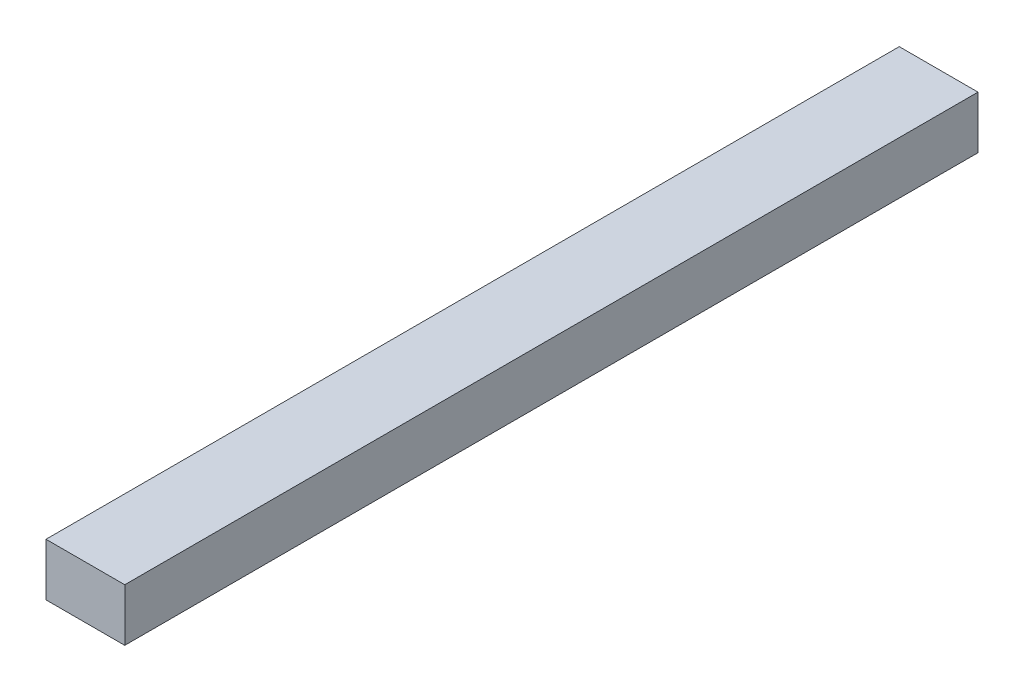
ISO-10303-21;
HEADER;
FILE_DESCRIPTION(('STEP AP214'),'2;1');
FILE_NAME('part.step','',(''),(''),'','','');
FILE_SCHEMA(('AUTOMOTIVE_DESIGN { 1 0 10303 214 1 1 1 1 }'));
ENDSEC;
DATA;
#1=APPLICATION_CONTEXT('core data for automotive mechanical design processes');
#2=APPLICATION_PROTOCOL_DEFINITION('international standard','automotive_design',2000,#1);
#3=PRODUCT_CONTEXT('',#1,'mechanical');
#4=PRODUCT('Part','Part','',(#3));
#5=PRODUCT_RELATED_PRODUCT_CATEGORY('part','',(#4));
#6=PRODUCT_DEFINITION_FORMATION('','',#4);
#7=PRODUCT_DEFINITION_CONTEXT('part definition',#1,'design');
#8=PRODUCT_DEFINITION('design','',#6,#7);
#9=PRODUCT_DEFINITION_SHAPE('','',#8);
#10=(LENGTH_UNIT() NAMED_UNIT(*) SI_UNIT(.MILLI.,.METRE.));
#11=(NAMED_UNIT(*) PLANE_ANGLE_UNIT() SI_UNIT($,.RADIAN.));
#12=(NAMED_UNIT(*) SI_UNIT($,.STERADIAN.) SOLID_ANGLE_UNIT());
#13=UNCERTAINTY_MEASURE_WITH_UNIT(LENGTH_MEASURE(1.E-05),#10,'distance_accuracy_value','');
#14=(GEOMETRIC_REPRESENTATION_CONTEXT(3) GLOBAL_UNCERTAINTY_ASSIGNED_CONTEXT((#13)) GLOBAL_UNIT_ASSIGNED_CONTEXT((#10,
#11,#12)) REPRESENTATION_CONTEXT('',''));
#15=CARTESIAN_POINT('',(0.,0.,0.));
#16=DIRECTION('',(0.,0.,1.));
#17=DIRECTION('',(1.,0.,0.));
#18=AXIS2_PLACEMENT_3D('',#15,#16,#17);
#19=CARTESIAN_POINT('',(-22.8801918066931,33.4498456304373,1300.));
#20=DIRECTION('',(1.,0.,0.));
#21=DIRECTION('',(0.,0.,-1.));
#22=AXIS2_PLACEMENT_3D('',#19,#20,#21);
#23=PLANE('',#22);
#24=DIRECTION('',(0.,-1.,0.));
#25=VECTOR('',#24,1.);
#26=CARTESIAN_POINT('',(-22.8801918066931,33.4498456304373,0.));
#27=LINE('',#26,#25);
#28=CARTESIAN_POINT('',(-22.8801918066931,33.4498456304373,0.));
#29=VERTEX_POINT('',#28);
#30=CARTESIAN_POINT('',(-22.8801918066931,-46.5501543695628,0.));
#31=VERTEX_POINT('',#30);
#32=EDGE_CURVE('E96',#29,#31,#27,.T.);
#33=ORIENTED_EDGE('',*,*,#32,.T.);
#34=DIRECTION('',(0.,0.,-1.));
#35=VECTOR('',#34,1.);
#36=CARTESIAN_POINT('',(-22.8801918066931,-46.5501543695628,1300.));
#37=LINE('',#36,#35);
#38=CARTESIAN_POINT('',(-22.8801918066931,-46.5501543695628,1300.));
#39=VERTEX_POINT('',#38);
#40=EDGE_CURVE('E11',#39,#31,#37,.T.);
#41=ORIENTED_EDGE('',*,*,#40,.F.);
#42=DIRECTION('',(0.,-1.,0.));
#43=VECTOR('',#42,1.);
#44=CARTESIAN_POINT('',(-22.8801918066931,33.4498456304373,1300.));
#45=LINE('',#44,#43);
#46=CARTESIAN_POINT('',(-22.8801918066931,33.4498456304373,1300.));
#47=VERTEX_POINT('',#46);
#48=EDGE_CURVE('E84',#47,#39,#45,.T.);
#49=ORIENTED_EDGE('',*,*,#48,.F.);
#50=DIRECTION('',(0.,0.,-1.));
#51=VECTOR('',#50,1.);
#52=CARTESIAN_POINT('',(-22.8801918066931,33.4498456304373,1300.));
#53=LINE('',#52,#51);
#54=EDGE_CURVE('E92',#47,#29,#53,.T.);
#55=ORIENTED_EDGE('',*,*,#54,.T.);
#56=EDGE_LOOP('',(#33,#41,#49,#55));
#57=FACE_BOUND('',#56,.T.);
#58=ADVANCED_FACE('F33',(#57),#23,.F.);
#59=CARTESIAN_POINT('',(-22.8801918066931,-46.5501543695628,1300.));
#60=DIRECTION('',(0.,1.,0.));
#61=DIRECTION('',(0.,0.,1.));
#62=AXIS2_PLACEMENT_3D('',#59,#60,#61);
#63=PLANE('',#62);
#64=DIRECTION('',(1.,0.,0.));
#65=VECTOR('',#64,1.);
#66=CARTESIAN_POINT('',(-22.8801918066931,-46.5501543695628,0.));
#67=LINE('',#66,#65);
#68=CARTESIAN_POINT('',(97.1198081933069,-46.5501543695628,0.));
#69=VERTEX_POINT('',#68);
#70=EDGE_CURVE('E88',#31,#69,#67,.T.);
#71=ORIENTED_EDGE('',*,*,#70,.T.);
#72=DIRECTION('',(0.,0.,-1.));
#73=VECTOR('',#72,1.);
#74=CARTESIAN_POINT('',(97.1198081933069,-46.5501543695628,1300.));
#75=LINE('',#74,#73);
#76=CARTESIAN_POINT('',(97.1198081933069,-46.5501543695628,1300.));
#77=VERTEX_POINT('',#76);
#78=EDGE_CURVE('E41',#77,#69,#75,.T.);
#79=ORIENTED_EDGE('',*,*,#78,.F.);
#80=DIRECTION('',(1.,0.,0.));
#81=VECTOR('',#80,1.);
#82=CARTESIAN_POINT('',(-22.8801918066931,-46.5501543695628,1300.));
#83=LINE('',#82,#81);
#84=EDGE_CURVE('E79',#39,#77,#83,.T.);
#85=ORIENTED_EDGE('',*,*,#84,.F.);
#86=ORIENTED_EDGE('',*,*,#40,.T.);
#87=EDGE_LOOP('',(#71,#79,#85,#86));
#88=FACE_BOUND('',#87,.T.);
#89=ADVANCED_FACE('F87',(#88),#63,.F.);
#90=CARTESIAN_POINT('',(97.1198081933069,33.4498456304373,1300.));
#91=DIRECTION('',(-1.,0.,0.));
#92=DIRECTION('',(0.,0.,1.));
#93=AXIS2_PLACEMENT_3D('',#90,#91,#92);
#94=PLANE('',#93);
#95=DIRECTION('',(0.,1.,0.));
#96=VECTOR('',#95,1.);
#97=CARTESIAN_POINT('',(97.1198081933069,33.4498456304373,0.));
#98=LINE('',#97,#96);
#99=CARTESIAN_POINT('',(97.1198081933069,33.4498456304373,0.));
#100=VERTEX_POINT('',#99);
#101=EDGE_CURVE('E66',#69,#100,#98,.T.);
#102=ORIENTED_EDGE('',*,*,#101,.T.);
#103=DIRECTION('',(0.,0.,-1.));
#104=VECTOR('',#103,1.);
#105=CARTESIAN_POINT('',(97.1198081933069,33.4498456304373,1300.));
#106=LINE('',#105,#104);
#107=CARTESIAN_POINT('',(97.1198081933069,33.4498456304373,1300.));
#108=VERTEX_POINT('',#107);
#109=EDGE_CURVE('E89',#108,#100,#106,.T.);
#110=ORIENTED_EDGE('',*,*,#109,.F.);
#111=DIRECTION('',(0.,1.,0.));
#112=VECTOR('',#111,1.);
#113=CARTESIAN_POINT('',(97.1198081933069,33.4498456304373,1300.));
#114=LINE('',#113,#112);
#115=EDGE_CURVE('E82',#77,#108,#114,.T.);
#116=ORIENTED_EDGE('',*,*,#115,.F.);
#117=ORIENTED_EDGE('',*,*,#78,.T.);
#118=EDGE_LOOP('',(#102,#110,#116,#117));
#119=FACE_BOUND('',#118,.T.);
#120=ADVANCED_FACE('F90',(#119),#94,.F.);
#121=CARTESIAN_POINT('',(-22.8801918066931,33.4498456304373,1300.));
#122=DIRECTION('',(0.,-1.,0.));
#123=DIRECTION('',(0.,0.,-1.));
#124=AXIS2_PLACEMENT_3D('',#121,#122,#123);
#125=PLANE('',#124);
#126=DIRECTION('',(-1.,0.,0.));
#127=VECTOR('',#126,1.);
#128=CARTESIAN_POINT('',(-22.8801918066931,33.4498456304373,0.));
#129=LINE('',#128,#127);
#130=EDGE_CURVE('E72',#100,#29,#129,.T.);
#131=ORIENTED_EDGE('',*,*,#130,.T.);
#132=ORIENTED_EDGE('',*,*,#54,.F.);
#133=DIRECTION('',(-1.,0.,0.));
#134=VECTOR('',#133,1.);
#135=CARTESIAN_POINT('',(-22.8801918066931,33.4498456304373,1300.));
#136=LINE('',#135,#134);
#137=EDGE_CURVE('E49',#108,#47,#136,.T.);
#138=ORIENTED_EDGE('',*,*,#137,.F.);
#139=ORIENTED_EDGE('',*,*,#109,.T.);
#140=EDGE_LOOP('',(#131,#132,#138,#139));
#141=FACE_BOUND('',#140,.T.);
#142=ADVANCED_FACE('F103',(#141),#125,.F.);
#143=CARTESIAN_POINT('',(-22.8801918066931,-46.5501543695628,1300.));
#144=DIRECTION('',(0.,0.,1.));
#145=DIRECTION('',(1.,0.,0.));
#146=AXIS2_PLACEMENT_3D('',#143,#144,#145);
#147=PLANE('',#146);
#148=ORIENTED_EDGE('',*,*,#48,.T.);
#149=ORIENTED_EDGE('',*,*,#84,.T.);
#150=ORIENTED_EDGE('',*,*,#115,.T.);
#151=ORIENTED_EDGE('',*,*,#137,.T.);
#152=EDGE_LOOP('',(#148,#149,#150,#151));
#153=FACE_BOUND('',#152,.T.);
#154=ADVANCED_FACE('F80',(#153),#147,.T.);
#155=CARTESIAN_POINT('',(-22.8801918066931,-46.5501543695628,0.));
#156=DIRECTION('',(0.,0.,1.));
#157=DIRECTION('',(1.,0.,0.));
#158=AXIS2_PLACEMENT_3D('',#155,#156,#157);
#159=PLANE('',#158);
#160=ORIENTED_EDGE('',*,*,#32,.F.);
#161=ORIENTED_EDGE('',*,*,#130,.F.);
#162=ORIENTED_EDGE('',*,*,#101,.F.);
#163=ORIENTED_EDGE('',*,*,#70,.F.);
#164=EDGE_LOOP('',(#160,#161,#162,#163));
#165=FACE_BOUND('',#164,.T.);
#166=ADVANCED_FACE('F106',(#165),#159,.F.);
#167=CLOSED_SHELL('',(#58,#89,#120,#142,#154,#166));
#168=MANIFOLD_SOLID_BREP('B2',#167);
#169=ADVANCED_BREP_SHAPE_REPRESENTATION('',(#18,#168),#14);
#170=SHAPE_DEFINITION_REPRESENTATION(#9,#169);
ENDSEC;
END-ISO-10303-21;
